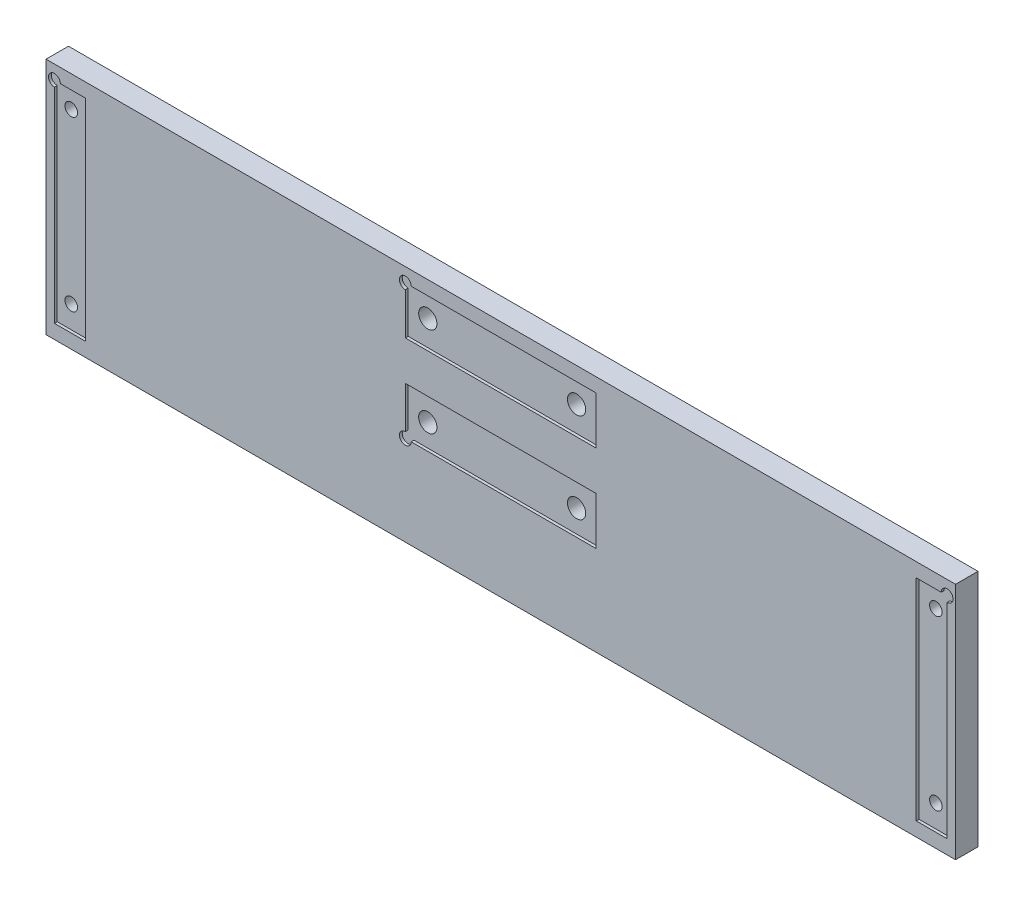
ISO-10303-21;
HEADER;
FILE_DESCRIPTION(('STEP AP214'),'2;1');
FILE_NAME('part.step','',(''),(''),'','','');
FILE_SCHEMA(('AUTOMOTIVE_DESIGN { 1 0 10303 214 1 1 1 1 }'));
ENDSEC;
DATA;
#1=APPLICATION_CONTEXT('core data for automotive mechanical design processes');
#2=APPLICATION_PROTOCOL_DEFINITION('international standard','automotive_design',2000,#1);
#3=PRODUCT_CONTEXT('',#1,'mechanical');
#4=PRODUCT('Part','Part','',(#3));
#5=PRODUCT_RELATED_PRODUCT_CATEGORY('part','',(#4));
#6=PRODUCT_DEFINITION_FORMATION('','',#4);
#7=PRODUCT_DEFINITION_CONTEXT('part definition',#1,'design');
#8=PRODUCT_DEFINITION('design','',#6,#7);
#9=PRODUCT_DEFINITION_SHAPE('','',#8);
#10=(LENGTH_UNIT() NAMED_UNIT(*) SI_UNIT(.MILLI.,.METRE.));
#11=(NAMED_UNIT(*) PLANE_ANGLE_UNIT() SI_UNIT($,.RADIAN.));
#12=(NAMED_UNIT(*) SI_UNIT($,.STERADIAN.) SOLID_ANGLE_UNIT());
#13=UNCERTAINTY_MEASURE_WITH_UNIT(LENGTH_MEASURE(1.E-05),#10,'distance_accuracy_value','');
#14=(GEOMETRIC_REPRESENTATION_CONTEXT(3) GLOBAL_UNCERTAINTY_ASSIGNED_CONTEXT((#13)) GLOBAL_UNIT_ASSIGNED_CONTEXT((#10,
#11,#12)) REPRESENTATION_CONTEXT('',''));
#15=CARTESIAN_POINT('',(0.,0.,0.));
#16=DIRECTION('',(0.,0.,1.));
#17=DIRECTION('',(1.,0.,0.));
#18=AXIS2_PLACEMENT_3D('',#15,#16,#17);
#19=CARTESIAN_POINT('',(0.,0.,8.));
#20=DIRECTION('',(0.,0.,1.));
#21=DIRECTION('',(1.,0.,0.));
#22=AXIS2_PLACEMENT_3D('',#19,#20,#21);
#23=PLANE('',#22);
#24=DIRECTION('',(0.,1.,0.));
#25=VECTOR('',#24,1.);
#26=CARTESIAN_POINT('',(34.,37.5,8.));
#27=LINE('',#26,#25);
#28=CARTESIAN_POINT('',(33.9999999999999,20.5,8.));
#29=VERTEX_POINT('',#28);
#30=CARTESIAN_POINT('',(34.,37.5,8.));
#31=VERTEX_POINT('',#30);
#32=EDGE_CURVE('E51',#29,#31,#27,.T.);
#33=ORIENTED_EDGE('',*,*,#32,.F.);
#34=DIRECTION('',(1.,0.,0.));
#35=VECTOR('',#34,1.);
#36=CARTESIAN_POINT('',(-33.9999999999999,20.5,8.));
#37=LINE('',#36,#35);
#38=CARTESIAN_POINT('',(-33.9999999999999,20.5,8.));
#39=VERTEX_POINT('',#38);
#40=EDGE_CURVE('E218',#39,#29,#37,.T.);
#41=ORIENTED_EDGE('',*,*,#40,.F.);
#42=DIRECTION('',(0.,-1.,0.));
#43=VECTOR('',#42,1.);
#44=CARTESIAN_POINT('',(-34.0000000000005,35.4,8.));
#45=LINE('',#44,#43);
#46=CARTESIAN_POINT('',(-34.0000000000005,35.4,8.));
#47=VERTEX_POINT('',#46);
#48=EDGE_CURVE('E221',#47,#39,#45,.T.);
#49=ORIENTED_EDGE('',*,*,#48,.F.);
#50=CARTESIAN_POINT('',(-34.,37.5,8.));
#51=DIRECTION('',(0.,0.,1.));
#52=DIRECTION('',(1.,0.,0.));
#53=AXIS2_PLACEMENT_3D('',#50,#51,#52);
#54=CIRCLE('',#53,2.09999999999972);
#55=CARTESIAN_POINT('',(-31.9000000000002,37.4999999999995,8.));
#56=VERTEX_POINT('',#55);
#57=EDGE_CURVE('E234',#56,#47,#54,.T.);
#58=ORIENTED_EDGE('',*,*,#57,.F.);
#59=DIRECTION('',(-1.,0.,0.));
#60=VECTOR('',#59,1.);
#61=CARTESIAN_POINT('',(-31.9000000000005,37.4999999999995,8.));
#62=LINE('',#61,#60);
#63=EDGE_CURVE('E232',#31,#56,#62,.T.);
#64=ORIENTED_EDGE('',*,*,#63,.F.);
#65=EDGE_LOOP('',(#33,#41,#49,#58,#64));
#66=FACE_BOUND('',#65,.T.);
#67=DIRECTION('',(0.,-1.,0.));
#68=VECTOR('',#67,1.);
#69=CARTESIAN_POINT('',(-34.0000000000005,-8.4,8.));
#70=LINE('',#69,#68);
#71=CARTESIAN_POINT('',(-33.9999999999999,6.5,8.));
#72=VERTEX_POINT('',#71);
#73=CARTESIAN_POINT('',(-34.0000000000005,-8.40000000000028,8.));
#74=VERTEX_POINT('',#73);
#75=EDGE_CURVE('E59',#72,#74,#70,.T.);
#76=ORIENTED_EDGE('',*,*,#75,.F.);
#77=DIRECTION('',(-1.,0.,0.));
#78=VECTOR('',#77,1.);
#79=CARTESIAN_POINT('',(-33.9999999999999,6.5,8.));
#80=LINE('',#79,#78);
#81=CARTESIAN_POINT('',(33.9999999999999,6.50000000000001,8.));
#82=VERTEX_POINT('',#81);
#83=EDGE_CURVE('E259',#82,#72,#80,.T.);
#84=ORIENTED_EDGE('',*,*,#83,.F.);
#85=DIRECTION('',(0.,1.,0.));
#86=VECTOR('',#85,1.);
#87=CARTESIAN_POINT('',(34.,-10.5,8.));
#88=LINE('',#87,#86);
#89=CARTESIAN_POINT('',(34.,-10.5,8.));
#90=VERTEX_POINT('',#89);
#91=EDGE_CURVE('E262',#90,#82,#88,.T.);
#92=ORIENTED_EDGE('',*,*,#91,.F.);
#93=DIRECTION('',(1.,0.,0.));
#94=VECTOR('',#93,1.);
#95=CARTESIAN_POINT('',(-31.9000000000005,-10.4999999999995,8.));
#96=LINE('',#95,#94);
#97=CARTESIAN_POINT('',(-31.9000000000005,-10.4999999999995,8.));
#98=VERTEX_POINT('',#97);
#99=EDGE_CURVE('E266',#98,#90,#96,.T.);
#100=ORIENTED_EDGE('',*,*,#99,.F.);
#101=CARTESIAN_POINT('',(-34.,-10.5,8.));
#102=DIRECTION('',(0.,0.,1.));
#103=DIRECTION('',(-1.,0.,0.));
#104=AXIS2_PLACEMENT_3D('',#101,#102,#103);
#105=CIRCLE('',#104,2.09999999999972);
#106=EDGE_CURVE('E269',#74,#98,#105,.T.);
#107=ORIENTED_EDGE('',*,*,#106,.F.);
#108=EDGE_LOOP('',(#76,#84,#92,#100,#107));
#109=FACE_BOUND('',#108,.T.);
#110=DIRECTION('',(0.,1.,0.));
#111=VECTOR('',#110,1.);
#112=CARTESIAN_POINT('',(159.,35.4,8.));
#113=LINE('',#112,#111);
#114=CARTESIAN_POINT('',(159.,-37.5,8.));
#115=VERTEX_POINT('',#114);
#116=CARTESIAN_POINT('',(159.,35.4,8.));
#117=VERTEX_POINT('',#116);
#118=EDGE_CURVE('E339',#115,#117,#113,.T.);
#119=ORIENTED_EDGE('',*,*,#118,.F.);
#120=DIRECTION('',(1.,0.,0.));
#121=VECTOR('',#120,1.);
#122=CARTESIAN_POINT('',(148.,-37.5,8.));
#123=LINE('',#122,#121);
#124=CARTESIAN_POINT('',(148.,-37.5,8.));
#125=VERTEX_POINT('',#124);
#126=EDGE_CURVE('E352',#125,#115,#123,.T.);
#127=ORIENTED_EDGE('',*,*,#126,.F.);
#128=DIRECTION('',(0.,-1.,0.));
#129=VECTOR('',#128,1.);
#130=CARTESIAN_POINT('',(148.,37.5,8.));
#131=LINE('',#130,#129);
#132=CARTESIAN_POINT('',(148.,37.5,8.));
#133=VERTEX_POINT('',#132);
#134=EDGE_CURVE('E372',#133,#125,#131,.T.);
#135=ORIENTED_EDGE('',*,*,#134,.F.);
#136=DIRECTION('',(-1.,0.,0.));
#137=VECTOR('',#136,1.);
#138=CARTESIAN_POINT('',(148.,37.5,8.));
#139=LINE('',#138,#137);
#140=CARTESIAN_POINT('',(156.9,37.5,8.));
#141=VERTEX_POINT('',#140);
#142=EDGE_CURVE('E369',#141,#133,#139,.T.);
#143=ORIENTED_EDGE('',*,*,#142,.F.);
#144=CARTESIAN_POINT('',(159.,37.5,8.));
#145=DIRECTION('',(0.,0.,1.));
#146=DIRECTION('',(-1.,0.,0.));
#147=AXIS2_PLACEMENT_3D('',#144,#145,#146);
#148=CIRCLE('',#147,2.09999999999999);
#149=EDGE_CURVE('E366',#117,#141,#148,.T.);
#150=ORIENTED_EDGE('',*,*,#149,.F.);
#151=EDGE_LOOP('',(#119,#127,#135,#143,#150));
#152=FACE_BOUND('',#151,.T.);
#153=DIRECTION('',(0.,1.,0.));
#154=VECTOR('',#153,1.);
#155=CARTESIAN_POINT('',(162.,42.5,8.));
#156=LINE('',#155,#154);
#157=CARTESIAN_POINT('',(162.,-42.5,8.));
#158=VERTEX_POINT('',#157);
#159=CARTESIAN_POINT('',(162.,42.5,8.));
#160=VERTEX_POINT('',#159);
#161=EDGE_CURVE('E388',#158,#160,#156,.T.);
#162=ORIENTED_EDGE('',*,*,#161,.T.);
#163=DIRECTION('',(-1.,0.,0.));
#164=VECTOR('',#163,1.);
#165=CARTESIAN_POINT('',(-162.,42.5,8.));
#166=LINE('',#165,#164);
#167=CARTESIAN_POINT('',(-162.,42.5,8.));
#168=VERTEX_POINT('',#167);
#169=EDGE_CURVE('E391',#160,#168,#166,.T.);
#170=ORIENTED_EDGE('',*,*,#169,.T.);
#171=DIRECTION('',(0.,-1.,0.));
#172=VECTOR('',#171,1.);
#173=CARTESIAN_POINT('',(-162.,42.5,8.));
#174=LINE('',#173,#172);
#175=CARTESIAN_POINT('',(-162.,-42.5,8.));
#176=VERTEX_POINT('',#175);
#177=EDGE_CURVE('E394',#168,#176,#174,.T.);
#178=ORIENTED_EDGE('',*,*,#177,.T.);
#179=DIRECTION('',(1.,0.,0.));
#180=VECTOR('',#179,1.);
#181=CARTESIAN_POINT('',(-162.,-42.5,8.));
#182=LINE('',#181,#180);
#183=EDGE_CURVE('E396',#176,#158,#182,.T.);
#184=ORIENTED_EDGE('',*,*,#183,.T.);
#185=EDGE_LOOP('',(#162,#170,#178,#184));
#186=FACE_BOUND('',#185,.T.);
#187=DIRECTION('',(-1.,0.,0.));
#188=VECTOR('',#187,1.);
#189=CARTESIAN_POINT('',(-148.,-37.5,8.));
#190=LINE('',#189,#188);
#191=CARTESIAN_POINT('',(-148.,-37.5,8.));
#192=VERTEX_POINT('',#191);
#193=CARTESIAN_POINT('',(-159.,-37.5,8.));
#194=VERTEX_POINT('',#193);
#195=EDGE_CURVE('E325',#192,#194,#190,.T.);
#196=ORIENTED_EDGE('',*,*,#195,.T.);
#197=DIRECTION('',(0.,1.,0.));
#198=VECTOR('',#197,1.);
#199=CARTESIAN_POINT('',(-159.,35.4,8.));
#200=LINE('',#199,#198);
#201=CARTESIAN_POINT('',(-159.,35.4,8.));
#202=VERTEX_POINT('',#201);
#203=EDGE_CURVE('E301',#194,#202,#200,.T.);
#204=ORIENTED_EDGE('',*,*,#203,.T.);
#205=CARTESIAN_POINT('',(-159.,37.5,8.));
#206=DIRECTION('',(0.,0.,-1.));
#207=DIRECTION('',(1.,0.,0.));
#208=AXIS2_PLACEMENT_3D('',#205,#206,#207);
#209=CIRCLE('',#208,2.09999999999999);
#210=CARTESIAN_POINT('',(-156.9,37.5,8.));
#211=VERTEX_POINT('',#210);
#212=EDGE_CURVE('E314',#202,#211,#209,.T.);
#213=ORIENTED_EDGE('',*,*,#212,.T.);
#214=DIRECTION('',(1.,0.,0.));
#215=VECTOR('',#214,1.);
#216=CARTESIAN_POINT('',(-148.,37.5,8.));
#217=LINE('',#216,#215);
#218=CARTESIAN_POINT('',(-148.,37.5,8.));
#219=VERTEX_POINT('',#218);
#220=EDGE_CURVE('E331',#211,#219,#217,.T.);
#221=ORIENTED_EDGE('',*,*,#220,.T.);
#222=DIRECTION('',(0.,-1.,0.));
#223=VECTOR('',#222,1.);
#224=CARTESIAN_POINT('',(-148.,37.5,8.));
#225=LINE('',#224,#223);
#226=EDGE_CURVE('E328',#219,#192,#225,.T.);
#227=ORIENTED_EDGE('',*,*,#226,.T.);
#228=EDGE_LOOP('',(#196,#204,#213,#221,#227));
#229=FACE_BOUND('',#228,.T.);
#230=ADVANCED_FACE('F36',(#66,#109,#152,#186,#229),#23,.T.);
#231=CARTESIAN_POINT('',(162.,42.5,8.));
#232=DIRECTION('',(-1.,0.,0.));
#233=DIRECTION('',(0.,0.,1.));
#234=AXIS2_PLACEMENT_3D('',#231,#232,#233);
#235=PLANE('',#234);
#236=DIRECTION('',(0.,1.,0.));
#237=VECTOR('',#236,1.);
#238=CARTESIAN_POINT('',(162.,42.5,0.));
#239=LINE('',#238,#237);
#240=CARTESIAN_POINT('',(162.,-42.5,0.));
#241=VERTEX_POINT('',#240);
#242=CARTESIAN_POINT('',(162.,42.5,0.));
#243=VERTEX_POINT('',#242);
#244=EDGE_CURVE('E379',#241,#243,#239,.T.);
#245=ORIENTED_EDGE('',*,*,#244,.T.);
#246=DIRECTION('',(0.,0.,-1.));
#247=VECTOR('',#246,1.);
#248=CARTESIAN_POINT('',(162.,42.5,8.));
#249=LINE('',#248,#247);
#250=EDGE_CURVE('E11',#160,#243,#249,.T.);
#251=ORIENTED_EDGE('',*,*,#250,.F.);
#252=ORIENTED_EDGE('',*,*,#161,.F.);
#253=DIRECTION('',(0.,0.,-1.));
#254=VECTOR('',#253,1.);
#255=CARTESIAN_POINT('',(162.,-42.5,8.));
#256=LINE('',#255,#254);
#257=EDGE_CURVE('E398',#158,#241,#256,.T.);
#258=ORIENTED_EDGE('',*,*,#257,.T.);
#259=EDGE_LOOP('',(#245,#251,#252,#258));
#260=FACE_BOUND('',#259,.T.);
#261=ADVANCED_FACE('F38',(#260),#235,.F.);
#262=CARTESIAN_POINT('',(-162.,42.5,8.));
#263=DIRECTION('',(0.,-1.,0.));
#264=DIRECTION('',(0.,0.,-1.));
#265=AXIS2_PLACEMENT_3D('',#262,#263,#264);
#266=PLANE('',#265);
#267=DIRECTION('',(-1.,0.,0.));
#268=VECTOR('',#267,1.);
#269=CARTESIAN_POINT('',(-162.,42.5,0.));
#270=LINE('',#269,#268);
#271=CARTESIAN_POINT('',(-162.,42.5,0.));
#272=VERTEX_POINT('',#271);
#273=EDGE_CURVE('E401',#243,#272,#270,.T.);
#274=ORIENTED_EDGE('',*,*,#273,.T.);
#275=DIRECTION('',(0.,0.,-1.));
#276=VECTOR('',#275,1.);
#277=CARTESIAN_POINT('',(-162.,42.5,8.));
#278=LINE('',#277,#276);
#279=EDGE_CURVE('E44',#168,#272,#278,.T.);
#280=ORIENTED_EDGE('',*,*,#279,.F.);
#281=ORIENTED_EDGE('',*,*,#169,.F.);
#282=ORIENTED_EDGE('',*,*,#250,.T.);
#283=EDGE_LOOP('',(#274,#280,#281,#282));
#284=FACE_BOUND('',#283,.T.);
#285=ADVANCED_FACE('F431',(#284),#266,.F.);
#286=CARTESIAN_POINT('',(-162.,42.5,8.));
#287=DIRECTION('',(1.,0.,0.));
#288=DIRECTION('',(0.,0.,-1.));
#289=AXIS2_PLACEMENT_3D('',#286,#287,#288);
#290=PLANE('',#289);
#291=DIRECTION('',(0.,-1.,0.));
#292=VECTOR('',#291,1.);
#293=CARTESIAN_POINT('',(-162.,42.5,0.));
#294=LINE('',#293,#292);
#295=CARTESIAN_POINT('',(-162.,-42.5,0.));
#296=VERTEX_POINT('',#295);
#297=EDGE_CURVE('E403',#272,#296,#294,.T.);
#298=ORIENTED_EDGE('',*,*,#297,.T.);
#299=DIRECTION('',(0.,0.,-1.));
#300=VECTOR('',#299,1.);
#301=CARTESIAN_POINT('',(-162.,-42.5,8.));
#302=LINE('',#301,#300);
#303=EDGE_CURVE('E408',#176,#296,#302,.T.);
#304=ORIENTED_EDGE('',*,*,#303,.F.);
#305=ORIENTED_EDGE('',*,*,#177,.F.);
#306=ORIENTED_EDGE('',*,*,#279,.T.);
#307=EDGE_LOOP('',(#298,#304,#305,#306));
#308=FACE_BOUND('',#307,.T.);
#309=ADVANCED_FACE('F415',(#308),#290,.F.);
#310=CARTESIAN_POINT('',(-162.,-42.5,8.));
#311=DIRECTION('',(0.,1.,0.));
#312=DIRECTION('',(0.,0.,1.));
#313=AXIS2_PLACEMENT_3D('',#310,#311,#312);
#314=PLANE('',#313);
#315=DIRECTION('',(1.,0.,0.));
#316=VECTOR('',#315,1.);
#317=CARTESIAN_POINT('',(-162.,-42.5,0.));
#318=LINE('',#317,#316);
#319=EDGE_CURVE('E392',#296,#241,#318,.T.);
#320=ORIENTED_EDGE('',*,*,#319,.T.);
#321=ORIENTED_EDGE('',*,*,#257,.F.);
#322=ORIENTED_EDGE('',*,*,#183,.F.);
#323=ORIENTED_EDGE('',*,*,#303,.T.);
#324=EDGE_LOOP('',(#320,#321,#322,#323));
#325=FACE_BOUND('',#324,.T.);
#326=ADVANCED_FACE('F424',(#325),#314,.F.);
#327=CARTESIAN_POINT('',(0.,0.,0.));
#328=DIRECTION('',(0.,0.,1.));
#329=DIRECTION('',(1.,0.,0.));
#330=AXIS2_PLACEMENT_3D('',#327,#328,#329);
#331=PLANE('',#330);
#332=CARTESIAN_POINT('',(-27.0000000000005,-2.5,0.));
#333=DIRECTION('',(0.,0.,1.));
#334=DIRECTION('',(-1.,0.,0.));
#335=AXIS2_PLACEMENT_3D('',#332,#333,#334);
#336=CIRCLE('',#335,3.25);
#337=CARTESIAN_POINT('',(-30.2500000000005,-2.5,0.));
#338=VERTEX_POINT('',#337);
#339=EDGE_CURVE('E874',#338,#338,#336,.T.);
#340=ORIENTED_EDGE('',*,*,#339,.T.);
#341=EDGE_LOOP('',(#340));
#342=FACE_BOUND('',#341,.T.);
#343=CARTESIAN_POINT('',(25.9999999999995,-2.50000000000001,0.));
#344=DIRECTION('',(0.,0.,1.));
#345=DIRECTION('',(1.,0.,0.));
#346=AXIS2_PLACEMENT_3D('',#343,#344,#345);
#347=CIRCLE('',#346,3.24999999999998);
#348=CARTESIAN_POINT('',(29.2499999999995,-2.50000000000001,0.));
#349=VERTEX_POINT('',#348);
#350=EDGE_CURVE('E878',#349,#349,#347,.T.);
#351=ORIENTED_EDGE('',*,*,#350,.T.);
#352=EDGE_LOOP('',(#351));
#353=FACE_BOUND('',#352,.T.);
#354=CARTESIAN_POINT('',(25.9999999999995,29.5,0.));
#355=DIRECTION('',(0.,0.,1.));
#356=DIRECTION('',(-1.,0.,0.));
#357=AXIS2_PLACEMENT_3D('',#354,#355,#356);
#358=CIRCLE('',#357,3.25);
#359=CARTESIAN_POINT('',(22.7499999999995,29.5,0.));
#360=VERTEX_POINT('',#359);
#361=EDGE_CURVE('E893',#360,#360,#358,.T.);
#362=ORIENTED_EDGE('',*,*,#361,.T.);
#363=EDGE_LOOP('',(#362));
#364=FACE_BOUND('',#363,.T.);
#365=CARTESIAN_POINT('',(-27.0000000000005,29.5,0.));
#366=DIRECTION('',(0.,0.,1.));
#367=DIRECTION('',(1.,0.,0.));
#368=AXIS2_PLACEMENT_3D('',#365,#366,#367);
#369=CIRCLE('',#368,3.25);
#370=CARTESIAN_POINT('',(-23.7500000000005,29.5,0.));
#371=VERTEX_POINT('',#370);
#372=EDGE_CURVE('E258',#371,#371,#369,.T.);
#373=ORIENTED_EDGE('',*,*,#372,.T.);
#374=EDGE_LOOP('',(#373));
#375=FACE_BOUND('',#374,.T.);
#376=CARTESIAN_POINT('',(-154.,30.5,0.));
#377=DIRECTION('',(0.,0.,-1.));
#378=DIRECTION('',(-1.,0.,0.));
#379=AXIS2_PLACEMENT_3D('',#376,#377,#378);
#380=CIRCLE('',#379,2.25000000000001);
#381=CARTESIAN_POINT('',(-156.25,30.5,0.));
#382=VERTEX_POINT('',#381);
#383=EDGE_CURVE('E286',#382,#382,#380,.T.);
#384=ORIENTED_EDGE('',*,*,#383,.F.);
#385=EDGE_LOOP('',(#384));
#386=FACE_BOUND('',#385,.T.);
#387=CARTESIAN_POINT('',(-154.,-29.5,0.));
#388=DIRECTION('',(0.,0.,-1.));
#389=DIRECTION('',(1.,0.,0.));
#390=AXIS2_PLACEMENT_3D('',#387,#388,#389);
#391=CIRCLE('',#390,2.25000000000001);
#392=CARTESIAN_POINT('',(-151.75,-29.5,0.));
#393=VERTEX_POINT('',#392);
#394=EDGE_CURVE('E293',#393,#393,#391,.T.);
#395=ORIENTED_EDGE('',*,*,#394,.F.);
#396=EDGE_LOOP('',(#395));
#397=FACE_BOUND('',#396,.T.);
#398=CARTESIAN_POINT('',(154.,30.5,0.));
#399=DIRECTION('',(0.,0.,1.));
#400=DIRECTION('',(1.,0.,0.));
#401=AXIS2_PLACEMENT_3D('',#398,#399,#400);
#402=CIRCLE('',#401,2.25000000000001);
#403=CARTESIAN_POINT('',(156.25,30.5,0.));
#404=VERTEX_POINT('',#403);
#405=EDGE_CURVE('E298',#404,#404,#402,.T.);
#406=ORIENTED_EDGE('',*,*,#405,.T.);
#407=EDGE_LOOP('',(#406));
#408=FACE_BOUND('',#407,.T.);
#409=CARTESIAN_POINT('',(154.,-29.5,0.));
#410=DIRECTION('',(0.,0.,1.));
#411=DIRECTION('',(-1.,0.,0.));
#412=AXIS2_PLACEMENT_3D('',#409,#410,#411);
#413=CIRCLE('',#412,2.25000000000001);
#414=CARTESIAN_POINT('',(151.75,-29.5,0.));
#415=VERTEX_POINT('',#414);
#416=EDGE_CURVE('E289',#415,#415,#413,.T.);
#417=ORIENTED_EDGE('',*,*,#416,.T.);
#418=EDGE_LOOP('',(#417));
#419=FACE_BOUND('',#418,.T.);
#420=ORIENTED_EDGE('',*,*,#244,.F.);
#421=ORIENTED_EDGE('',*,*,#319,.F.);
#422=ORIENTED_EDGE('',*,*,#297,.F.);
#423=ORIENTED_EDGE('',*,*,#273,.F.);
#424=EDGE_LOOP('',(#420,#421,#422,#423));
#425=FACE_BOUND('',#424,.T.);
#426=ADVANCED_FACE('F421',(#342,#353,#364,#375,#386,#397,#408,#419,#425),#331,.F.);
#427=CARTESIAN_POINT('',(159.,35.4,7.));
#428=DIRECTION('',(1.,0.,0.));
#429=DIRECTION('',(0.,1.,0.));
#430=AXIS2_PLACEMENT_3D('',#427,#428,#429);
#431=PLANE('',#430);
#432=ORIENTED_EDGE('',*,*,#118,.T.);
#433=DIRECTION('',(0.,0.,1.));
#434=VECTOR('',#433,1.);
#435=CARTESIAN_POINT('',(159.,35.4,7.));
#436=LINE('',#435,#434);
#437=CARTESIAN_POINT('',(159.,35.4,7.));
#438=VERTEX_POINT('',#437);
#439=EDGE_CURVE('E364',#438,#117,#436,.T.);
#440=ORIENTED_EDGE('',*,*,#439,.F.);
#441=DIRECTION('',(0.,1.,0.));
#442=VECTOR('',#441,1.);
#443=CARTESIAN_POINT('',(159.,35.4,7.));
#444=LINE('',#443,#442);
#445=CARTESIAN_POINT('',(159.,-37.5,7.));
#446=VERTEX_POINT('',#445);
#447=EDGE_CURVE('E348',#446,#438,#444,.T.);
#448=ORIENTED_EDGE('',*,*,#447,.F.);
#449=DIRECTION('',(0.,0.,1.));
#450=VECTOR('',#449,1.);
#451=CARTESIAN_POINT('',(159.,-37.5,7.));
#452=LINE('',#451,#450);
#453=EDGE_CURVE('E377',#446,#115,#452,.T.);
#454=ORIENTED_EDGE('',*,*,#453,.T.);
#455=EDGE_LOOP('',(#432,#440,#448,#454));
#456=FACE_BOUND('',#455,.T.);
#457=ADVANCED_FACE('F446',(#456),#431,.F.);
#458=CARTESIAN_POINT('',(148.,-37.5,7.));
#459=DIRECTION('',(0.,-1.,0.));
#460=DIRECTION('',(0.,0.,-1.));
#461=AXIS2_PLACEMENT_3D('',#458,#459,#460);
#462=PLANE('',#461);
#463=ORIENTED_EDGE('',*,*,#126,.T.);
#464=ORIENTED_EDGE('',*,*,#453,.F.);
#465=DIRECTION('',(1.,0.,0.));
#466=VECTOR('',#465,1.);
#467=CARTESIAN_POINT('',(148.,-37.5,7.));
#468=LINE('',#467,#466);
#469=CARTESIAN_POINT('',(148.,-37.5,7.));
#470=VERTEX_POINT('',#469);
#471=EDGE_CURVE('E361',#470,#446,#468,.T.);
#472=ORIENTED_EDGE('',*,*,#471,.F.);
#473=DIRECTION('',(0.,0.,1.));
#474=VECTOR('',#473,1.);
#475=CARTESIAN_POINT('',(148.,-37.5,7.));
#476=LINE('',#475,#474);
#477=EDGE_CURVE('E380',#470,#125,#476,.T.);
#478=ORIENTED_EDGE('',*,*,#477,.T.);
#479=EDGE_LOOP('',(#463,#464,#472,#478));
#480=FACE_BOUND('',#479,.T.);
#481=ADVANCED_FACE('F468',(#480),#462,.F.);
#482=CARTESIAN_POINT('',(148.,37.5,7.));
#483=DIRECTION('',(-1.,0.,0.));
#484=DIRECTION('',(0.,0.,1.));
#485=AXIS2_PLACEMENT_3D('',#482,#483,#484);
#486=PLANE('',#485);
#487=ORIENTED_EDGE('',*,*,#134,.T.);
#488=ORIENTED_EDGE('',*,*,#477,.F.);
#489=DIRECTION('',(0.,-1.,0.));
#490=VECTOR('',#489,1.);
#491=CARTESIAN_POINT('',(148.,37.5,7.));
#492=LINE('',#491,#490);
#493=CARTESIAN_POINT('',(148.,37.5,7.));
#494=VERTEX_POINT('',#493);
#495=EDGE_CURVE('E358',#494,#470,#492,.T.);
#496=ORIENTED_EDGE('',*,*,#495,.F.);
#497=DIRECTION('',(0.,0.,1.));
#498=VECTOR('',#497,1.);
#499=CARTESIAN_POINT('',(148.,37.5,7.));
#500=LINE('',#499,#498);
#501=EDGE_CURVE('E382',#494,#133,#500,.T.);
#502=ORIENTED_EDGE('',*,*,#501,.T.);
#503=EDGE_LOOP('',(#487,#488,#496,#502));
#504=FACE_BOUND('',#503,.T.);
#505=ADVANCED_FACE('F475',(#504),#486,.F.);
#506=CARTESIAN_POINT('',(148.,37.5,7.));
#507=DIRECTION('',(0.,1.,0.));
#508=DIRECTION('',(0.,0.,1.));
#509=AXIS2_PLACEMENT_3D('',#506,#507,#508);
#510=PLANE('',#509);
#511=ORIENTED_EDGE('',*,*,#142,.T.);
#512=ORIENTED_EDGE('',*,*,#501,.F.);
#513=DIRECTION('',(-1.,0.,0.));
#514=VECTOR('',#513,1.);
#515=CARTESIAN_POINT('',(148.,37.5,7.));
#516=LINE('',#515,#514);
#517=CARTESIAN_POINT('',(156.9,37.5,7.));
#518=VERTEX_POINT('',#517);
#519=EDGE_CURVE('E355',#518,#494,#516,.T.);
#520=ORIENTED_EDGE('',*,*,#519,.F.);
#521=DIRECTION('',(0.,0.,1.));
#522=VECTOR('',#521,1.);
#523=CARTESIAN_POINT('',(156.9,37.5,7.));
#524=LINE('',#523,#522);
#525=EDGE_CURVE('E384',#518,#141,#524,.T.);
#526=ORIENTED_EDGE('',*,*,#525,.T.);
#527=EDGE_LOOP('',(#511,#512,#520,#526));
#528=FACE_BOUND('',#527,.T.);
#529=ADVANCED_FACE('F483',(#528),#510,.F.);
#530=CARTESIAN_POINT('',(159.,37.5,7.));
#531=DIRECTION('',(0.,0.,1.));
#532=DIRECTION('',(1.,0.,0.));
#533=AXIS2_PLACEMENT_3D('',#530,#531,#532);
#534=CYLINDRICAL_SURFACE('',#533,2.09999999999999);
#535=ORIENTED_EDGE('',*,*,#149,.T.);
#536=ORIENTED_EDGE('',*,*,#525,.F.);
#537=CARTESIAN_POINT('',(159.,37.5,7.));
#538=DIRECTION('',(0.,0.,1.));
#539=DIRECTION('',(-1.,0.,0.));
#540=AXIS2_PLACEMENT_3D('',#537,#538,#539);
#541=CIRCLE('',#540,2.09999999999999);
#542=EDGE_CURVE('E351',#438,#518,#541,.T.);
#543=ORIENTED_EDGE('',*,*,#542,.F.);
#544=ORIENTED_EDGE('',*,*,#439,.T.);
#545=EDGE_LOOP('',(#535,#536,#543,#544));
#546=FACE_BOUND('',#545,.T.);
#547=ADVANCED_FACE('F491',(#546),#534,.F.);
#548=CARTESIAN_POINT('',(159.,37.5,7.));
#549=DIRECTION('',(0.,0.,-1.));
#550=DIRECTION('',(-1.,0.,0.));
#551=AXIS2_PLACEMENT_3D('',#548,#549,#550);
#552=PLANE('',#551);
#553=CARTESIAN_POINT('',(154.,30.5,7.));
#554=DIRECTION('',(0.,0.,1.));
#555=DIRECTION('',(1.,0.,0.));
#556=AXIS2_PLACEMENT_3D('',#553,#554,#555);
#557=CIRCLE('',#556,2.25000000000001);
#558=CARTESIAN_POINT('',(156.25,30.5,7.));
#559=VERTEX_POINT('',#558);
#560=EDGE_CURVE('E302',#559,#559,#557,.T.);
#561=ORIENTED_EDGE('',*,*,#560,.F.);
#562=EDGE_LOOP('',(#561));
#563=FACE_BOUND('',#562,.T.);
#564=CARTESIAN_POINT('',(154.,-29.5,7.));
#565=DIRECTION('',(0.,0.,1.));
#566=DIRECTION('',(-1.,0.,0.));
#567=AXIS2_PLACEMENT_3D('',#564,#565,#566);
#568=CIRCLE('',#567,2.25000000000001);
#569=CARTESIAN_POINT('',(151.75,-29.5,7.));
#570=VERTEX_POINT('',#569);
#571=EDGE_CURVE('E305',#570,#570,#568,.T.);
#572=ORIENTED_EDGE('',*,*,#571,.F.);
#573=EDGE_LOOP('',(#572));
#574=FACE_BOUND('',#573,.T.);
#575=ORIENTED_EDGE('',*,*,#447,.T.);
#576=ORIENTED_EDGE('',*,*,#542,.T.);
#577=ORIENTED_EDGE('',*,*,#519,.T.);
#578=ORIENTED_EDGE('',*,*,#495,.T.);
#579=ORIENTED_EDGE('',*,*,#471,.T.);
#580=EDGE_LOOP('',(#575,#576,#577,#578,#579));
#581=FACE_BOUND('',#580,.T.);
#582=ADVANCED_FACE('F499',(#563,#574,#581),#552,.F.);
#583=CARTESIAN_POINT('',(-159.,35.4,7.));
#584=DIRECTION('',(1.,0.,0.));
#585=DIRECTION('',(0.,1.,0.));
#586=AXIS2_PLACEMENT_3D('',#583,#584,#585);
#587=PLANE('',#586);
#588=ORIENTED_EDGE('',*,*,#203,.F.);
#589=DIRECTION('',(0.,0.,1.));
#590=VECTOR('',#589,1.);
#591=CARTESIAN_POINT('',(-159.,-37.5,7.));
#592=LINE('',#591,#590);
#593=CARTESIAN_POINT('',(-159.,-37.5,7.));
#594=VERTEX_POINT('',#593);
#595=EDGE_CURVE('E322',#594,#194,#592,.T.);
#596=ORIENTED_EDGE('',*,*,#595,.F.);
#597=DIRECTION('',(0.,1.,0.));
#598=VECTOR('',#597,1.);
#599=CARTESIAN_POINT('',(-159.,35.4,7.));
#600=LINE('',#599,#598);
#601=CARTESIAN_POINT('',(-159.,35.4,7.));
#602=VERTEX_POINT('',#601);
#603=EDGE_CURVE('E310',#594,#602,#600,.T.);
#604=ORIENTED_EDGE('',*,*,#603,.T.);
#605=DIRECTION('',(0.,0.,1.));
#606=VECTOR('',#605,1.);
#607=CARTESIAN_POINT('',(-159.,35.4,7.));
#608=LINE('',#607,#606);
#609=EDGE_CURVE('E336',#602,#202,#608,.T.);
#610=ORIENTED_EDGE('',*,*,#609,.T.);
#611=EDGE_LOOP('',(#588,#596,#604,#610));
#612=FACE_BOUND('',#611,.T.);
#613=ADVANCED_FACE('F507',(#612),#587,.T.);
#614=CARTESIAN_POINT('',(-159.,37.5,7.));
#615=DIRECTION('',(0.,0.,1.));
#616=DIRECTION('',(1.,0.,0.));
#617=AXIS2_PLACEMENT_3D('',#614,#615,#616);
#618=CYLINDRICAL_SURFACE('',#617,2.09999999999999);
#619=ORIENTED_EDGE('',*,*,#212,.F.);
#620=ORIENTED_EDGE('',*,*,#609,.F.);
#621=CARTESIAN_POINT('',(-159.,37.5,7.));
#622=DIRECTION('',(0.,0.,-1.));
#623=DIRECTION('',(1.,0.,0.));
#624=AXIS2_PLACEMENT_3D('',#621,#622,#623);
#625=CIRCLE('',#624,2.09999999999999);
#626=CARTESIAN_POINT('',(-156.9,37.5,7.));
#627=VERTEX_POINT('',#626);
#628=EDGE_CURVE('E320',#602,#627,#625,.T.);
#629=ORIENTED_EDGE('',*,*,#628,.T.);
#630=DIRECTION('',(0.,0.,1.));
#631=VECTOR('',#630,1.);
#632=CARTESIAN_POINT('',(-156.9,37.5,7.));
#633=LINE('',#632,#631);
#634=EDGE_CURVE('E340',#627,#211,#633,.T.);
#635=ORIENTED_EDGE('',*,*,#634,.T.);
#636=EDGE_LOOP('',(#619,#620,#629,#635));
#637=FACE_BOUND('',#636,.T.);
#638=ADVANCED_FACE('F516',(#637),#618,.F.);
#639=CARTESIAN_POINT('',(-148.,37.5,7.));
#640=DIRECTION('',(0.,-1.,0.));
#641=DIRECTION('',(0.,0.,-1.));
#642=AXIS2_PLACEMENT_3D('',#639,#640,#641);
#643=PLANE('',#642);
#644=ORIENTED_EDGE('',*,*,#220,.F.);
#645=ORIENTED_EDGE('',*,*,#634,.F.);
#646=DIRECTION('',(1.,0.,0.));
#647=VECTOR('',#646,1.);
#648=CARTESIAN_POINT('',(-148.,37.5,7.));
#649=LINE('',#648,#647);
#650=CARTESIAN_POINT('',(-148.,37.5,7.));
#651=VERTEX_POINT('',#650);
#652=EDGE_CURVE('E318',#627,#651,#649,.T.);
#653=ORIENTED_EDGE('',*,*,#652,.T.);
#654=DIRECTION('',(0.,0.,1.));
#655=VECTOR('',#654,1.);
#656=CARTESIAN_POINT('',(-148.,37.5,7.));
#657=LINE('',#656,#655);
#658=EDGE_CURVE('E342',#651,#219,#657,.T.);
#659=ORIENTED_EDGE('',*,*,#658,.T.);
#660=EDGE_LOOP('',(#644,#645,#653,#659));
#661=FACE_BOUND('',#660,.T.);
#662=ADVANCED_FACE('F524',(#661),#643,.T.);
#663=CARTESIAN_POINT('',(-148.,37.5,7.));
#664=DIRECTION('',(-1.,0.,0.));
#665=DIRECTION('',(0.,0.,1.));
#666=AXIS2_PLACEMENT_3D('',#663,#664,#665);
#667=PLANE('',#666);
#668=ORIENTED_EDGE('',*,*,#226,.F.);
#669=ORIENTED_EDGE('',*,*,#658,.F.);
#670=DIRECTION('',(0.,-1.,0.));
#671=VECTOR('',#670,1.);
#672=CARTESIAN_POINT('',(-148.,37.5,7.));
#673=LINE('',#672,#671);
#674=CARTESIAN_POINT('',(-148.,-37.5,7.));
#675=VERTEX_POINT('',#674);
#676=EDGE_CURVE('E316',#651,#675,#673,.T.);
#677=ORIENTED_EDGE('',*,*,#676,.T.);
#678=DIRECTION('',(0.,0.,1.));
#679=VECTOR('',#678,1.);
#680=CARTESIAN_POINT('',(-148.,-37.5,7.));
#681=LINE('',#680,#679);
#682=EDGE_CURVE('E344',#675,#192,#681,.T.);
#683=ORIENTED_EDGE('',*,*,#682,.T.);
#684=EDGE_LOOP('',(#668,#669,#677,#683));
#685=FACE_BOUND('',#684,.T.);
#686=ADVANCED_FACE('F532',(#685),#667,.T.);
#687=CARTESIAN_POINT('',(-148.,-37.5,7.));
#688=DIRECTION('',(0.,1.,0.));
#689=DIRECTION('',(0.,0.,1.));
#690=AXIS2_PLACEMENT_3D('',#687,#688,#689);
#691=PLANE('',#690);
#692=ORIENTED_EDGE('',*,*,#195,.F.);
#693=ORIENTED_EDGE('',*,*,#682,.F.);
#694=DIRECTION('',(-1.,0.,0.));
#695=VECTOR('',#694,1.);
#696=CARTESIAN_POINT('',(-148.,-37.5,7.));
#697=LINE('',#696,#695);
#698=EDGE_CURVE('E313',#675,#594,#697,.T.);
#699=ORIENTED_EDGE('',*,*,#698,.T.);
#700=ORIENTED_EDGE('',*,*,#595,.T.);
#701=EDGE_LOOP('',(#692,#693,#699,#700));
#702=FACE_BOUND('',#701,.T.);
#703=ADVANCED_FACE('F540',(#702),#691,.T.);
#704=CARTESIAN_POINT('',(-159.,37.5,7.));
#705=DIRECTION('',(0.,0.,-1.));
#706=DIRECTION('',(1.,0.,0.));
#707=AXIS2_PLACEMENT_3D('',#704,#705,#706);
#708=PLANE('',#707);
#709=CARTESIAN_POINT('',(-154.,30.5,7.));
#710=DIRECTION('',(0.,0.,-1.));
#711=DIRECTION('',(-1.,0.,0.));
#712=AXIS2_PLACEMENT_3D('',#709,#710,#711);
#713=CIRCLE('',#712,2.25000000000001);
#714=CARTESIAN_POINT('',(-156.25,30.5,7.));
#715=VERTEX_POINT('',#714);
#716=EDGE_CURVE('E290',#715,#715,#713,.T.);
#717=ORIENTED_EDGE('',*,*,#716,.T.);
#718=EDGE_LOOP('',(#717));
#719=FACE_BOUND('',#718,.T.);
#720=CARTESIAN_POINT('',(-154.,-29.5,7.));
#721=DIRECTION('',(0.,0.,-1.));
#722=DIRECTION('',(1.,0.,0.));
#723=AXIS2_PLACEMENT_3D('',#720,#721,#722);
#724=CIRCLE('',#723,2.25000000000001);
#725=CARTESIAN_POINT('',(-151.75,-29.5,7.));
#726=VERTEX_POINT('',#725);
#727=EDGE_CURVE('E241',#726,#726,#724,.T.);
#728=ORIENTED_EDGE('',*,*,#727,.T.);
#729=EDGE_LOOP('',(#728));
#730=FACE_BOUND('',#729,.T.);
#731=ORIENTED_EDGE('',*,*,#603,.F.);
#732=ORIENTED_EDGE('',*,*,#698,.F.);
#733=ORIENTED_EDGE('',*,*,#676,.F.);
#734=ORIENTED_EDGE('',*,*,#652,.F.);
#735=ORIENTED_EDGE('',*,*,#628,.F.);
#736=EDGE_LOOP('',(#731,#732,#733,#734,#735));
#737=FACE_BOUND('',#736,.T.);
#738=ADVANCED_FACE('F547',(#719,#730,#737),#708,.F.);
#739=CARTESIAN_POINT('',(154.,-29.5,0.));
#740=DIRECTION('',(0.,0.,1.));
#741=DIRECTION('',(1.,0.,0.));
#742=AXIS2_PLACEMENT_3D('',#739,#740,#741);
#743=CYLINDRICAL_SURFACE('',#742,2.25000000000001);
#744=ORIENTED_EDGE('',*,*,#416,.F.);
#745=EDGE_LOOP('',(#744));
#746=FACE_BOUND('',#745,.T.);
#747=ORIENTED_EDGE('',*,*,#571,.T.);
#748=EDGE_LOOP('',(#747));
#749=FACE_BOUND('',#748,.T.);
#750=ADVANCED_FACE('F555',(#746,#749),#743,.F.);
#751=CARTESIAN_POINT('',(154.,30.5,0.));
#752=DIRECTION('',(0.,0.,1.));
#753=DIRECTION('',(1.,0.,0.));
#754=AXIS2_PLACEMENT_3D('',#751,#752,#753);
#755=CYLINDRICAL_SURFACE('',#754,2.25000000000001);
#756=ORIENTED_EDGE('',*,*,#405,.F.);
#757=EDGE_LOOP('',(#756));
#758=FACE_BOUND('',#757,.T.);
#759=ORIENTED_EDGE('',*,*,#560,.T.);
#760=EDGE_LOOP('',(#759));
#761=FACE_BOUND('',#760,.T.);
#762=ADVANCED_FACE('F564',(#758,#761),#755,.F.);
#763=CARTESIAN_POINT('',(-154.,-29.5,0.));
#764=DIRECTION('',(0.,0.,1.));
#765=DIRECTION('',(1.,0.,0.));
#766=AXIS2_PLACEMENT_3D('',#763,#764,#765);
#767=CYLINDRICAL_SURFACE('',#766,2.25000000000001);
#768=ORIENTED_EDGE('',*,*,#394,.T.);
#769=EDGE_LOOP('',(#768));
#770=FACE_BOUND('',#769,.T.);
#771=ORIENTED_EDGE('',*,*,#727,.F.);
#772=EDGE_LOOP('',(#771));
#773=FACE_BOUND('',#772,.T.);
#774=ADVANCED_FACE('F571',(#770,#773),#767,.F.);
#775=CARTESIAN_POINT('',(-154.,30.5,0.));
#776=DIRECTION('',(0.,0.,1.));
#777=DIRECTION('',(1.,0.,0.));
#778=AXIS2_PLACEMENT_3D('',#775,#776,#777);
#779=CYLINDRICAL_SURFACE('',#778,2.25000000000001);
#780=ORIENTED_EDGE('',*,*,#383,.T.);
#781=EDGE_LOOP('',(#780));
#782=FACE_BOUND('',#781,.T.);
#783=ORIENTED_EDGE('',*,*,#716,.F.);
#784=EDGE_LOOP('',(#783));
#785=FACE_BOUND('',#784,.T.);
#786=ADVANCED_FACE('F578',(#782,#785),#779,.F.);
#787=CARTESIAN_POINT('',(-34.0000000000005,-8.4,7.));
#788=DIRECTION('',(-1.,0.,0.));
#789=DIRECTION('',(0.,-1.,0.));
#790=AXIS2_PLACEMENT_3D('',#787,#788,#789);
#791=PLANE('',#790);
#792=ORIENTED_EDGE('',*,*,#75,.T.);
#793=DIRECTION('',(0.,0.,1.));
#794=VECTOR('',#793,1.);
#795=CARTESIAN_POINT('',(-34.0000000000005,-8.40000000000028,7.));
#796=LINE('',#795,#794);
#797=CARTESIAN_POINT('',(-34.0000000000005,-8.40000000000028,7.));
#798=VERTEX_POINT('',#797);
#799=EDGE_CURVE('E247',#798,#74,#796,.T.);
#800=ORIENTED_EDGE('',*,*,#799,.F.);
#801=DIRECTION('',(0.,-1.,0.));
#802=VECTOR('',#801,1.);
#803=CARTESIAN_POINT('',(-34.0000000000005,-8.4,7.));
#804=LINE('',#803,#802);
#805=CARTESIAN_POINT('',(-33.9999999999999,6.5,7.));
#806=VERTEX_POINT('',#805);
#807=EDGE_CURVE('E263',#806,#798,#804,.T.);
#808=ORIENTED_EDGE('',*,*,#807,.F.);
#809=DIRECTION('',(0.,0.,1.));
#810=VECTOR('',#809,1.);
#811=CARTESIAN_POINT('',(-33.9999999999999,6.5,7.));
#812=LINE('',#811,#810);
#813=EDGE_CURVE('E256',#806,#72,#812,.T.);
#814=ORIENTED_EDGE('',*,*,#813,.T.);
#815=EDGE_LOOP('',(#792,#800,#808,#814));
#816=FACE_BOUND('',#815,.T.);
#817=ADVANCED_FACE('F586',(#816),#791,.F.);
#818=CARTESIAN_POINT('',(-33.9999999999999,6.5,7.));
#819=DIRECTION('',(0.,1.,0.));
#820=DIRECTION('',(-1.,0.,0.));
#821=AXIS2_PLACEMENT_3D('',#818,#819,#820);
#822=PLANE('',#821);
#823=ORIENTED_EDGE('',*,*,#83,.T.);
#824=ORIENTED_EDGE('',*,*,#813,.F.);
#825=DIRECTION('',(-1.,0.,0.));
#826=VECTOR('',#825,1.);
#827=CARTESIAN_POINT('',(-33.9999999999999,6.5,7.));
#828=LINE('',#827,#826);
#829=CARTESIAN_POINT('',(33.9999999999999,6.50000000000001,7.));
#830=VERTEX_POINT('',#829);
#831=EDGE_CURVE('E249',#830,#806,#828,.T.);
#832=ORIENTED_EDGE('',*,*,#831,.F.);
#833=DIRECTION('',(0.,0.,1.));
#834=VECTOR('',#833,1.);
#835=CARTESIAN_POINT('',(33.9999999999999,6.50000000000001,7.));
#836=LINE('',#835,#834);
#837=EDGE_CURVE('E254',#830,#82,#836,.T.);
#838=ORIENTED_EDGE('',*,*,#837,.T.);
#839=EDGE_LOOP('',(#823,#824,#832,#838));
#840=FACE_BOUND('',#839,.T.);
#841=ADVANCED_FACE('F594',(#840),#822,.F.);
#842=CARTESIAN_POINT('',(34.,-10.5,7.));
#843=DIRECTION('',(1.,0.,0.));
#844=DIRECTION('',(0.,1.,0.));
#845=AXIS2_PLACEMENT_3D('',#842,#843,#844);
#846=PLANE('',#845);
#847=ORIENTED_EDGE('',*,*,#91,.T.);
#848=ORIENTED_EDGE('',*,*,#837,.F.);
#849=DIRECTION('',(0.,1.,0.));
#850=VECTOR('',#849,1.);
#851=CARTESIAN_POINT('',(34.,-10.5,7.));
#852=LINE('',#851,#850);
#853=CARTESIAN_POINT('',(34.,-10.5,7.));
#854=VERTEX_POINT('',#853);
#855=EDGE_CURVE('E275',#854,#830,#852,.T.);
#856=ORIENTED_EDGE('',*,*,#855,.F.);
#857=DIRECTION('',(0.,0.,1.));
#858=VECTOR('',#857,1.);
#859=CARTESIAN_POINT('',(34.,-10.5,7.));
#860=LINE('',#859,#858);
#861=EDGE_CURVE('E252',#854,#90,#860,.T.);
#862=ORIENTED_EDGE('',*,*,#861,.T.);
#863=EDGE_LOOP('',(#847,#848,#856,#862));
#864=FACE_BOUND('',#863,.T.);
#865=ADVANCED_FACE('F601',(#864),#846,.F.);
#866=CARTESIAN_POINT('',(-31.9000000000005,-10.4999999999995,7.));
#867=DIRECTION('',(0.,-1.,0.));
#868=DIRECTION('',(1.,0.,0.));
#869=AXIS2_PLACEMENT_3D('',#866,#867,#868);
#870=PLANE('',#869);
#871=ORIENTED_EDGE('',*,*,#99,.T.);
#872=ORIENTED_EDGE('',*,*,#861,.F.);
#873=DIRECTION('',(1.,0.,0.));
#874=VECTOR('',#873,1.);
#875=CARTESIAN_POINT('',(-31.9000000000005,-10.4999999999995,7.));
#876=LINE('',#875,#874);
#877=CARTESIAN_POINT('',(-31.9000000000005,-10.4999999999995,7.));
#878=VERTEX_POINT('',#877);
#879=EDGE_CURVE('E278',#878,#854,#876,.T.);
#880=ORIENTED_EDGE('',*,*,#879,.F.);
#881=DIRECTION('',(0.,0.,1.));
#882=VECTOR('',#881,1.);
#883=CARTESIAN_POINT('',(-31.9000000000005,-10.4999999999995,7.));
#884=LINE('',#883,#882);
#885=EDGE_CURVE('E250',#878,#98,#884,.T.);
#886=ORIENTED_EDGE('',*,*,#885,.T.);
#887=EDGE_LOOP('',(#871,#872,#880,#886));
#888=FACE_BOUND('',#887,.T.);
#889=ADVANCED_FACE('F609',(#888),#870,.F.);
#890=CARTESIAN_POINT('',(-34.,-10.5,7.));
#891=DIRECTION('',(0.,0.,1.));
#892=DIRECTION('',(1.,0.,0.));
#893=AXIS2_PLACEMENT_3D('',#890,#891,#892);
#894=CYLINDRICAL_SURFACE('',#893,2.09999999999972);
#895=ORIENTED_EDGE('',*,*,#106,.T.);
#896=ORIENTED_EDGE('',*,*,#885,.F.);
#897=CARTESIAN_POINT('',(-34.,-10.5,7.));
#898=DIRECTION('',(0.,0.,1.));
#899=DIRECTION('',(-1.,0.,0.));
#900=AXIS2_PLACEMENT_3D('',#897,#898,#899);
#901=CIRCLE('',#900,2.09999999999972);
#902=EDGE_CURVE('E281',#798,#878,#901,.T.);
#903=ORIENTED_EDGE('',*,*,#902,.F.);
#904=ORIENTED_EDGE('',*,*,#799,.T.);
#905=EDGE_LOOP('',(#895,#896,#903,#904));
#906=FACE_BOUND('',#905,.T.);
#907=ADVANCED_FACE('F617',(#906),#894,.F.);
#908=CARTESIAN_POINT('',(-34.,-10.5,7.));
#909=DIRECTION('',(0.,0.,-1.));
#910=DIRECTION('',(-1.,0.,0.));
#911=AXIS2_PLACEMENT_3D('',#908,#909,#910);
#912=PLANE('',#911);
#913=CARTESIAN_POINT('',(-27.0000000000005,-2.5,7.));
#914=DIRECTION('',(0.,0.,1.));
#915=DIRECTION('',(-1.,0.,0.));
#916=AXIS2_PLACEMENT_3D('',#913,#914,#915);
#917=CIRCLE('',#916,3.25);
#918=CARTESIAN_POINT('',(-30.2500000000005,-2.5,7.));
#919=VERTEX_POINT('',#918);
#920=EDGE_CURVE('E877',#919,#919,#917,.T.);
#921=ORIENTED_EDGE('',*,*,#920,.F.);
#922=EDGE_LOOP('',(#921));
#923=FACE_BOUND('',#922,.T.);
#924=CARTESIAN_POINT('',(25.9999999999995,-2.50000000000001,7.));
#925=DIRECTION('',(0.,0.,1.));
#926=DIRECTION('',(1.,0.,0.));
#927=AXIS2_PLACEMENT_3D('',#924,#925,#926);
#928=CIRCLE('',#927,3.24999999999998);
#929=CARTESIAN_POINT('',(29.2499999999995,-2.50000000000001,7.));
#930=VERTEX_POINT('',#929);
#931=EDGE_CURVE('E881',#930,#930,#928,.T.);
#932=ORIENTED_EDGE('',*,*,#931,.F.);
#933=EDGE_LOOP('',(#932));
#934=FACE_BOUND('',#933,.T.);
#935=ORIENTED_EDGE('',*,*,#807,.T.);
#936=ORIENTED_EDGE('',*,*,#902,.T.);
#937=ORIENTED_EDGE('',*,*,#879,.T.);
#938=ORIENTED_EDGE('',*,*,#855,.T.);
#939=ORIENTED_EDGE('',*,*,#831,.T.);
#940=EDGE_LOOP('',(#935,#936,#937,#938,#939));
#941=FACE_BOUND('',#940,.T.);
#942=ADVANCED_FACE('F625',(#923,#934,#941),#912,.F.);
#943=CARTESIAN_POINT('',(34.,37.5,7.));
#944=DIRECTION('',(1.,0.,0.));
#945=DIRECTION('',(0.,1.,0.));
#946=AXIS2_PLACEMENT_3D('',#943,#944,#945);
#947=PLANE('',#946);
#948=ORIENTED_EDGE('',*,*,#32,.T.);
#949=DIRECTION('',(0.,0.,1.));
#950=VECTOR('',#949,1.);
#951=CARTESIAN_POINT('',(34.,37.5,7.));
#952=LINE('',#951,#950);
#953=CARTESIAN_POINT('',(34.,37.5,7.));
#954=VERTEX_POINT('',#953);
#955=EDGE_CURVE('E195',#954,#31,#952,.T.);
#956=ORIENTED_EDGE('',*,*,#955,.F.);
#957=DIRECTION('',(0.,1.,0.));
#958=VECTOR('',#957,1.);
#959=CARTESIAN_POINT('',(34.,37.5,7.));
#960=LINE('',#959,#958);
#961=CARTESIAN_POINT('',(33.9999999999999,20.5,7.));
#962=VERTEX_POINT('',#961);
#963=EDGE_CURVE('E199',#962,#954,#960,.T.);
#964=ORIENTED_EDGE('',*,*,#963,.F.);
#965=DIRECTION('',(0.,0.,1.));
#966=VECTOR('',#965,1.);
#967=CARTESIAN_POINT('',(33.9999999999999,20.5,7.));
#968=LINE('',#967,#966);
#969=EDGE_CURVE('E239',#962,#29,#968,.T.);
#970=ORIENTED_EDGE('',*,*,#969,.T.);
#971=EDGE_LOOP('',(#948,#956,#964,#970));
#972=FACE_BOUND('',#971,.T.);
#973=ADVANCED_FACE('F197',(#972),#947,.F.);
#974=CARTESIAN_POINT('',(-33.9999999999999,20.5,7.));
#975=DIRECTION('',(0.,-1.,0.));
#976=DIRECTION('',(1.,0.,0.));
#977=AXIS2_PLACEMENT_3D('',#974,#975,#976);
#978=PLANE('',#977);
#979=ORIENTED_EDGE('',*,*,#40,.T.);
#980=ORIENTED_EDGE('',*,*,#969,.F.);
#981=DIRECTION('',(1.,0.,0.));
#982=VECTOR('',#981,1.);
#983=CARTESIAN_POINT('',(-33.9999999999999,20.5,7.));
#984=LINE('',#983,#982);
#985=CARTESIAN_POINT('',(-33.9999999999999,20.5,7.));
#986=VERTEX_POINT('',#985);
#987=EDGE_CURVE('E205',#986,#962,#984,.T.);
#988=ORIENTED_EDGE('',*,*,#987,.F.);
#989=DIRECTION('',(0.,0.,1.));
#990=VECTOR('',#989,1.);
#991=CARTESIAN_POINT('',(-33.9999999999999,20.5,7.));
#992=LINE('',#991,#990);
#993=EDGE_CURVE('E242',#986,#39,#992,.T.);
#994=ORIENTED_EDGE('',*,*,#993,.T.);
#995=EDGE_LOOP('',(#979,#980,#988,#994));
#996=FACE_BOUND('',#995,.T.);
#997=ADVANCED_FACE('F640',(#996),#978,.F.);
#998=CARTESIAN_POINT('',(-34.0000000000005,35.4,7.));
#999=DIRECTION('',(-1.,0.,0.));
#1000=DIRECTION('',(0.,-1.,0.));
#1001=AXIS2_PLACEMENT_3D('',#998,#999,#1000);
#1002=PLANE('',#1001);
#1003=ORIENTED_EDGE('',*,*,#48,.T.);
#1004=ORIENTED_EDGE('',*,*,#993,.F.);
#1005=DIRECTION('',(0.,-1.,0.));
#1006=VECTOR('',#1005,1.);
#1007=CARTESIAN_POINT('',(-34.0000000000005,35.4,7.));
#1008=LINE('',#1007,#1006);
#1009=CARTESIAN_POINT('',(-34.0000000000005,35.4,7.));
#1010=VERTEX_POINT('',#1009);
#1011=EDGE_CURVE('E228',#1010,#986,#1008,.T.);
#1012=ORIENTED_EDGE('',*,*,#1011,.F.);
#1013=DIRECTION('',(0.,0.,1.));
#1014=VECTOR('',#1013,1.);
#1015=CARTESIAN_POINT('',(-34.0000000000005,35.4,7.));
#1016=LINE('',#1015,#1014);
#1017=EDGE_CURVE('E244',#1010,#47,#1016,.T.);
#1018=ORIENTED_EDGE('',*,*,#1017,.T.);
#1019=EDGE_LOOP('',(#1003,#1004,#1012,#1018));
#1020=FACE_BOUND('',#1019,.T.);
#1021=ADVANCED_FACE('F647',(#1020),#1002,.F.);
#1022=CARTESIAN_POINT('',(-34.,37.5,7.));
#1023=DIRECTION('',(0.,0.,1.));
#1024=DIRECTION('',(1.,0.,0.));
#1025=AXIS2_PLACEMENT_3D('',#1022,#1023,#1024);
#1026=CYLINDRICAL_SURFACE('',#1025,2.09999999999972);
#1027=ORIENTED_EDGE('',*,*,#57,.T.);
#1028=ORIENTED_EDGE('',*,*,#1017,.F.);
#1029=CARTESIAN_POINT('',(-34.,37.5,7.));
#1030=DIRECTION('',(0.,0.,1.));
#1031=DIRECTION('',(1.,0.,0.));
#1032=AXIS2_PLACEMENT_3D('',#1029,#1030,#1031);
#1033=CIRCLE('',#1032,2.09999999999972);
#1034=CARTESIAN_POINT('',(-31.9000000000002,37.4999999999995,7.));
#1035=VERTEX_POINT('',#1034);
#1036=EDGE_CURVE('E213',#1035,#1010,#1033,.T.);
#1037=ORIENTED_EDGE('',*,*,#1036,.F.);
#1038=DIRECTION('',(0.,0.,1.));
#1039=VECTOR('',#1038,1.);
#1040=CARTESIAN_POINT('',(-31.9000000000002,37.4999999999995,7.));
#1041=LINE('',#1040,#1039);
#1042=EDGE_CURVE('E204',#1035,#56,#1041,.T.);
#1043=ORIENTED_EDGE('',*,*,#1042,.T.);
#1044=EDGE_LOOP('',(#1027,#1028,#1037,#1043));
#1045=FACE_BOUND('',#1044,.T.);
#1046=ADVANCED_FACE('F655',(#1045),#1026,.F.);
#1047=CARTESIAN_POINT('',(-31.9000000000005,37.4999999999995,7.));
#1048=DIRECTION('',(0.,1.,0.));
#1049=DIRECTION('',(-1.,0.,0.));
#1050=AXIS2_PLACEMENT_3D('',#1047,#1048,#1049);
#1051=PLANE('',#1050);
#1052=ORIENTED_EDGE('',*,*,#63,.T.);
#1053=ORIENTED_EDGE('',*,*,#1042,.F.);
#1054=DIRECTION('',(-1.,0.,0.));
#1055=VECTOR('',#1054,1.);
#1056=CARTESIAN_POINT('',(-31.9000000000005,37.4999999999995,7.));
#1057=LINE('',#1056,#1055);
#1058=EDGE_CURVE('E208',#954,#1035,#1057,.T.);
#1059=ORIENTED_EDGE('',*,*,#1058,.F.);
#1060=ORIENTED_EDGE('',*,*,#955,.T.);
#1061=EDGE_LOOP('',(#1052,#1053,#1059,#1060));
#1062=FACE_BOUND('',#1061,.T.);
#1063=ADVANCED_FACE('F209',(#1062),#1051,.F.);
#1064=CARTESIAN_POINT('',(-34.,37.5,7.));
#1065=DIRECTION('',(0.,0.,1.));
#1066=DIRECTION('',(1.,0.,0.));
#1067=AXIS2_PLACEMENT_3D('',#1064,#1065,#1066);
#1068=PLANE('',#1067);
#1069=CARTESIAN_POINT('',(25.9999999999995,29.5,7.));
#1070=DIRECTION('',(0.,0.,1.));
#1071=DIRECTION('',(-1.,0.,0.));
#1072=AXIS2_PLACEMENT_3D('',#1069,#1070,#1071);
#1073=CIRCLE('',#1072,3.25);
#1074=CARTESIAN_POINT('',(22.7499999999995,29.5,7.));
#1075=VERTEX_POINT('',#1074);
#1076=EDGE_CURVE('E889',#1075,#1075,#1073,.T.);
#1077=ORIENTED_EDGE('',*,*,#1076,.F.);
#1078=EDGE_LOOP('',(#1077));
#1079=FACE_BOUND('',#1078,.T.);
#1080=CARTESIAN_POINT('',(-27.0000000000005,29.5,7.));
#1081=DIRECTION('',(0.,0.,1.));
#1082=DIRECTION('',(1.,0.,0.));
#1083=AXIS2_PLACEMENT_3D('',#1080,#1081,#1082);
#1084=CIRCLE('',#1083,3.25);
#1085=CARTESIAN_POINT('',(-23.7500000000005,29.5,7.));
#1086=VERTEX_POINT('',#1085);
#1087=EDGE_CURVE('E224',#1086,#1086,#1084,.T.);
#1088=ORIENTED_EDGE('',*,*,#1087,.F.);
#1089=EDGE_LOOP('',(#1088));
#1090=FACE_BOUND('',#1089,.T.);
#1091=ORIENTED_EDGE('',*,*,#963,.T.);
#1092=ORIENTED_EDGE('',*,*,#1058,.T.);
#1093=ORIENTED_EDGE('',*,*,#1036,.T.);
#1094=ORIENTED_EDGE('',*,*,#1011,.T.);
#1095=ORIENTED_EDGE('',*,*,#987,.T.);
#1096=EDGE_LOOP('',(#1091,#1092,#1093,#1094,#1095));
#1097=FACE_BOUND('',#1096,.T.);
#1098=ADVANCED_FACE('F215',(#1079,#1090,#1097),#1068,.T.);
#1099=CARTESIAN_POINT('',(-27.0000000000005,29.5,0.));
#1100=DIRECTION('',(0.,0.,1.));
#1101=DIRECTION('',(1.,0.,0.));
#1102=AXIS2_PLACEMENT_3D('',#1099,#1100,#1101);
#1103=CYLINDRICAL_SURFACE('',#1102,3.25);
#1104=ORIENTED_EDGE('',*,*,#372,.F.);
#1105=EDGE_LOOP('',(#1104));
#1106=FACE_BOUND('',#1105,.T.);
#1107=ORIENTED_EDGE('',*,*,#1087,.T.);
#1108=EDGE_LOOP('',(#1107));
#1109=FACE_BOUND('',#1108,.T.);
#1110=ADVANCED_FACE('F674',(#1106,#1109),#1103,.F.);
#1111=CARTESIAN_POINT('',(25.9999999999995,29.5,0.));
#1112=DIRECTION('',(0.,0.,1.));
#1113=DIRECTION('',(1.,0.,0.));
#1114=AXIS2_PLACEMENT_3D('',#1111,#1112,#1113);
#1115=CYLINDRICAL_SURFACE('',#1114,3.25);
#1116=ORIENTED_EDGE('',*,*,#361,.F.);
#1117=EDGE_LOOP('',(#1116));
#1118=FACE_BOUND('',#1117,.T.);
#1119=ORIENTED_EDGE('',*,*,#1076,.T.);
#1120=EDGE_LOOP('',(#1119));
#1121=FACE_BOUND('',#1120,.T.);
#1122=ADVANCED_FACE('F682',(#1118,#1121),#1115,.F.);
#1123=CARTESIAN_POINT('',(25.9999999999995,-2.50000000000001,0.));
#1124=DIRECTION('',(0.,0.,1.));
#1125=DIRECTION('',(1.,0.,0.));
#1126=AXIS2_PLACEMENT_3D('',#1123,#1124,#1125);
#1127=CYLINDRICAL_SURFACE('',#1126,3.24999999999998);
#1128=ORIENTED_EDGE('',*,*,#350,.F.);
#1129=EDGE_LOOP('',(#1128));
#1130=FACE_BOUND('',#1129,.T.);
#1131=ORIENTED_EDGE('',*,*,#931,.T.);
#1132=EDGE_LOOP('',(#1131));
#1133=FACE_BOUND('',#1132,.T.);
#1134=ADVANCED_FACE('F690',(#1130,#1133),#1127,.F.);
#1135=CARTESIAN_POINT('',(-27.0000000000005,-2.5,0.));
#1136=DIRECTION('',(0.,0.,1.));
#1137=DIRECTION('',(1.,0.,0.));
#1138=AXIS2_PLACEMENT_3D('',#1135,#1136,#1137);
#1139=CYLINDRICAL_SURFACE('',#1138,3.25);
#1140=ORIENTED_EDGE('',*,*,#339,.F.);
#1141=EDGE_LOOP('',(#1140));
#1142=FACE_BOUND('',#1141,.T.);
#1143=ORIENTED_EDGE('',*,*,#920,.T.);
#1144=EDGE_LOOP('',(#1143));
#1145=FACE_BOUND('',#1144,.T.);
#1146=ADVANCED_FACE('F698',(#1142,#1145),#1139,.F.);
#1147=CLOSED_SHELL('',(#230,#261,#285,#309,#326,#426,#457,#481,#505,#529,#547,#582,#613,#638,
#662,#686,#703,#738,#750,#762,#774,#786,#817,#841,#865,#889,#907,#942,#973,#997,#1021,#1046,
#1063,#1098,#1110,#1122,#1134,#1146));
#1148=MANIFOLD_SOLID_BREP('B2',#1147);
#1149=ADVANCED_BREP_SHAPE_REPRESENTATION('',(#18,#1148),#14);
#1150=SHAPE_DEFINITION_REPRESENTATION(#9,#1149);
ENDSEC;
END-ISO-10303-21;
